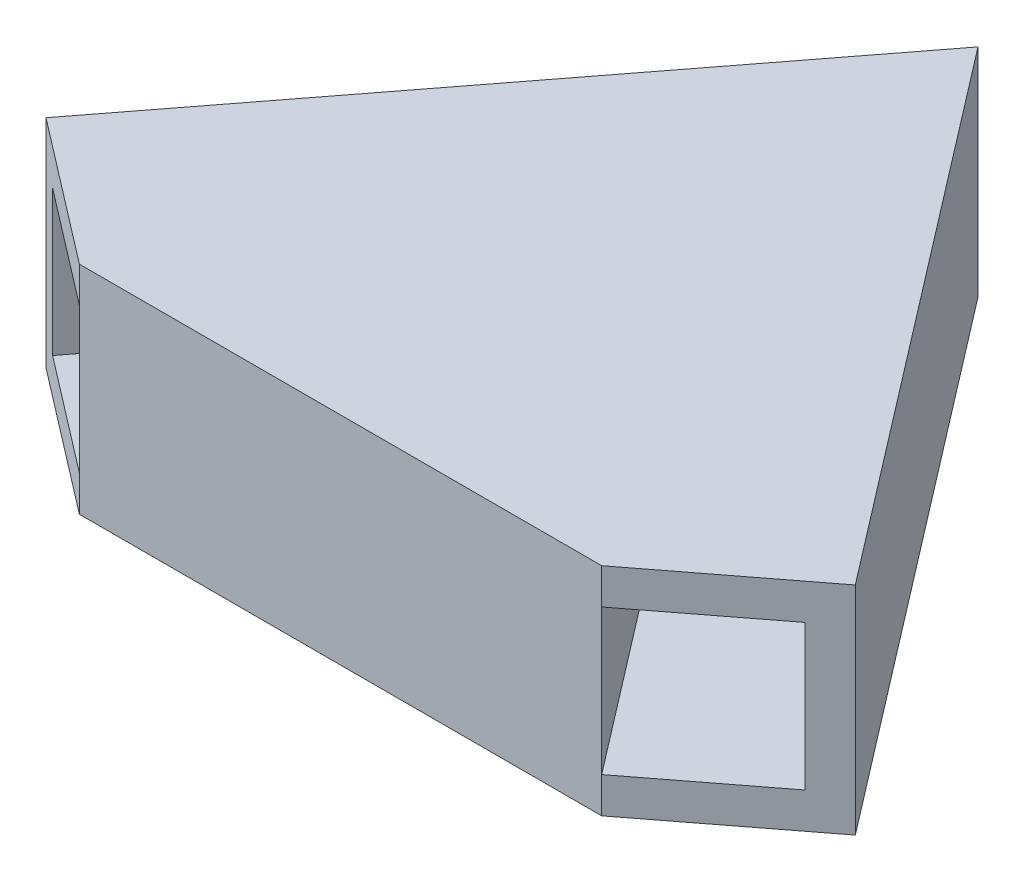
ISO-10303-21;
HEADER;
FILE_DESCRIPTION(('STEP AP214'),'2;1');
FILE_NAME('part.step','',(''),(''),'','','');
FILE_SCHEMA(('AUTOMOTIVE_DESIGN { 1 0 10303 214 1 1 1 1 }'));
ENDSEC;
DATA;
#1=APPLICATION_CONTEXT('core data for automotive mechanical design processes');
#2=APPLICATION_PROTOCOL_DEFINITION('international standard','automotive_design',2000,#1);
#3=PRODUCT_CONTEXT('',#1,'mechanical');
#4=PRODUCT('Part','Part','',(#3));
#5=PRODUCT_RELATED_PRODUCT_CATEGORY('part','',(#4));
#6=PRODUCT_DEFINITION_FORMATION('','',#4);
#7=PRODUCT_DEFINITION_CONTEXT('part definition',#1,'design');
#8=PRODUCT_DEFINITION('design','',#6,#7);
#9=PRODUCT_DEFINITION_SHAPE('','',#8);
#10=(LENGTH_UNIT() NAMED_UNIT(*) SI_UNIT(.MILLI.,.METRE.));
#11=(NAMED_UNIT(*) PLANE_ANGLE_UNIT() SI_UNIT($,.RADIAN.));
#12=(NAMED_UNIT(*) SI_UNIT($,.STERADIAN.) SOLID_ANGLE_UNIT());
#13=UNCERTAINTY_MEASURE_WITH_UNIT(LENGTH_MEASURE(1.E-05),#10,'distance_accuracy_value','');
#14=(GEOMETRIC_REPRESENTATION_CONTEXT(3) GLOBAL_UNCERTAINTY_ASSIGNED_CONTEXT((#13)) GLOBAL_UNIT_ASSIGNED_CONTEXT((#10,
#11,#12)) REPRESENTATION_CONTEXT('',''));
#15=CARTESIAN_POINT('',(0.,0.,0.));
#16=DIRECTION('',(0.,0.,1.));
#17=DIRECTION('',(1.,0.,0.));
#18=AXIS2_PLACEMENT_3D('',#15,#16,#17);
#19=CARTESIAN_POINT('',(0.,5.,0.));
#20=DIRECTION('',(0.,-1.,0.));
#21=DIRECTION('',(0.,0.,-1.));
#22=AXIS2_PLACEMENT_3D('',#19,#20,#21);
#23=PLANE('',#22);
#24=DIRECTION('',(-0.608761429008711,0.,0.793353340291243));
#25=VECTOR('',#24,1.);
#26=CARTESIAN_POINT('',(-36.5256857405226,5.,47.6012004174746));
#27=LINE('',#26,#25);
#28=CARTESIAN_POINT('',(-0.926476193621818,5.,1.20740728286133));
#29=VERTEX_POINT('',#28);
#30=CARTESIAN_POINT('',(-36.5256857405226,5.,47.6012004174746));
#31=VERTEX_POINT('',#30);
#32=EDGE_CURVE('E182',#29,#31,#27,.T.);
#33=ORIENTED_EDGE('',*,*,#32,.F.);
#34=DIRECTION('',(0.793353340291243,0.,0.608761429008711));
#35=VECTOR('',#34,1.);
#36=CARTESIAN_POINT('',(-17.0315490015341,5.,-11.1504497260155));
#37=LINE('',#36,#35);
#38=CARTESIAN_POINT('',(-17.0315490015341,5.,-11.1504497260155));
#39=VERTEX_POINT('',#38);
#40=EDGE_CURVE('E193',#39,#29,#37,.T.);
#41=ORIENTED_EDGE('',*,*,#40,.F.);
#42=DIRECTION('',(0.608761429008711,0.,-0.793353340291243));
#43=VECTOR('',#42,1.);
#44=CARTESIAN_POINT('',(0.,5.,-33.3463965236036));
#45=LINE('',#44,#43);
#46=CARTESIAN_POINT('',(-52.6307585484349,5.,35.2433434085977));
#47=VERTEX_POINT('',#46);
#48=EDGE_CURVE('E212',#47,#39,#45,.T.);
#49=ORIENTED_EDGE('',*,*,#48,.F.);
#50=DIRECTION('',(0.793353340291243,0.,0.60876142900871));
#51=VECTOR('',#50,1.);
#52=CARTESIAN_POINT('',(-36.5256857405226,5.,47.6012004174746));
#53=LINE('',#52,#51);
#54=EDGE_CURVE('E222',#47,#31,#53,.T.);
#55=ORIENTED_EDGE('',*,*,#54,.T.);
#56=EDGE_LOOP('',(#33,#41,#49,#55));
#57=FACE_BOUND('',#56,.T.);
#58=ADVANCED_FACE('F33',(#57),#23,.F.);
#59=CARTESIAN_POINT('',(0.,25.3,0.));
#60=DIRECTION('',(0.,1.,0.));
#61=DIRECTION('',(0.,0.,1.));
#62=AXIS2_PLACEMENT_3D('',#59,#60,#61);
#63=PLANE('',#62);
#64=DIRECTION('',(-0.608761429008711,0.,0.793353340291243));
#65=VECTOR('',#64,1.);
#66=CARTESIAN_POINT('',(-36.5256857405226,25.3,47.6012004174746));
#67=LINE('',#66,#65);
#68=CARTESIAN_POINT('',(-0.926476193621812,25.3,1.20740728286134));
#69=VERTEX_POINT('',#68);
#70=CARTESIAN_POINT('',(-36.5256857405226,25.3,47.6012004174746));
#71=VERTEX_POINT('',#70);
#72=EDGE_CURVE('E185',#69,#71,#67,.T.);
#73=ORIENTED_EDGE('',*,*,#72,.T.);
#74=DIRECTION('',(0.793353340291243,0.,0.60876142900871));
#75=VECTOR('',#74,1.);
#76=CARTESIAN_POINT('',(-56.5975252498911,25.3,32.1995362635542));
#77=LINE('',#76,#75);
#78=CARTESIAN_POINT('',(-52.6307585484349,25.3,35.2433434085977));
#79=VERTEX_POINT('',#78);
#80=EDGE_CURVE('E198',#79,#71,#77,.T.);
#81=ORIENTED_EDGE('',*,*,#80,.F.);
#82=DIRECTION('',(0.608761429008711,0.,-0.793353340291243));
#83=VECTOR('',#82,1.);
#84=CARTESIAN_POINT('',(0.,25.3,-33.3463965236036));
#85=LINE('',#84,#83);
#86=CARTESIAN_POINT('',(-17.0315490015341,25.3,-11.1504497260155));
#87=VERTEX_POINT('',#86);
#88=EDGE_CURVE('E213',#79,#87,#85,.T.);
#89=ORIENTED_EDGE('',*,*,#88,.T.);
#90=DIRECTION('',(0.793353340291243,0.,0.608761429008711));
#91=VECTOR('',#90,1.);
#92=CARTESIAN_POINT('',(-17.0315490015341,25.3,-11.1504497260155));
#93=LINE('',#92,#91);
#94=EDGE_CURVE('E195',#87,#69,#93,.T.);
#95=ORIENTED_EDGE('',*,*,#94,.T.);
#96=EDGE_LOOP('',(#73,#81,#89,#95));
#97=FACE_BOUND('',#96,.T.);
#98=ADVANCED_FACE('F274',(#97),#63,.F.);
#99=CARTESIAN_POINT('',(-17.0315490015341,64.4621464483065,-11.1504497260155));
#100=DIRECTION('',(0.608761429008711,0.,-0.793353340291243));
#101=DIRECTION('',(-0.793353340291243,0.,-0.608761429008711));
#102=AXIS2_PLACEMENT_3D('',#99,#100,#101);
#103=PLANE('',#102);
#104=DIRECTION('',(0.,-1.,0.));
#105=VECTOR('',#104,1.);
#106=CARTESIAN_POINT('',(-0.926476193621818,84.3466744214499,1.20740728286133));
#107=LINE('',#106,#105);
#108=EDGE_CURVE('E186',#69,#29,#107,.T.);
#109=ORIENTED_EDGE('',*,*,#108,.F.);
#110=ORIENTED_EDGE('',*,*,#94,.F.);
#111=DIRECTION('',(0.,-1.,0.));
#112=VECTOR('',#111,1.);
#113=CARTESIAN_POINT('',(-17.0315490015341,64.4621464483065,-11.1504497260155));
#114=LINE('',#113,#112);
#115=EDGE_CURVE('E188',#87,#39,#114,.T.);
#116=ORIENTED_EDGE('',*,*,#115,.T.);
#117=ORIENTED_EDGE('',*,*,#40,.T.);
#118=EDGE_LOOP('',(#109,#110,#116,#117));
#119=FACE_BOUND('',#118,.T.);
#120=ADVANCED_FACE('F276',(#119),#103,.F.);
#121=CARTESIAN_POINT('',(0.,25.3,-33.3463965236036));
#122=DIRECTION('',(-0.793353340291243,0.,-0.608761429008711));
#123=DIRECTION('',(-0.608761429008711,0.,0.793353340291243));
#124=AXIS2_PLACEMENT_3D('',#121,#122,#123);
#125=PLANE('',#124);
#126=ORIENTED_EDGE('',*,*,#115,.F.);
#127=ORIENTED_EDGE('',*,*,#88,.F.);
#128=DIRECTION('',(0.,-1.,0.));
#129=VECTOR('',#128,1.);
#130=CARTESIAN_POINT('',(-52.6307585484349,25.3,35.2433434085977));
#131=LINE('',#130,#129);
#132=EDGE_CURVE('E216',#79,#47,#131,.T.);
#133=ORIENTED_EDGE('',*,*,#132,.T.);
#134=ORIENTED_EDGE('',*,*,#48,.T.);
#135=EDGE_LOOP('',(#126,#127,#133,#134));
#136=FACE_BOUND('',#135,.T.);
#137=ADVANCED_FACE('F271',(#136),#125,.F.);
#138=CARTESIAN_POINT('',(-36.5256857405226,5.,47.6012004174746));
#139=DIRECTION('',(0.60876142900871,0.,-0.793353340291243));
#140=DIRECTION('',(-0.793353340291243,0.,-0.608761429008711));
#141=AXIS2_PLACEMENT_3D('',#138,#139,#140);
#142=PLANE('',#141);
#143=DIRECTION('',(0.793353340291243,0.,0.60876142900871));
#144=VECTOR('',#143,1.);
#145=CARTESIAN_POINT('',(-36.5256857405226,0.,47.6012004174746));
#146=LINE('',#145,#144);
#147=CARTESIAN_POINT('',(-56.5975252498911,0.,32.1995362635542));
#148=VERTEX_POINT('',#147);
#149=CARTESIAN_POINT('',(-36.5256857405226,0.,47.6012004174746));
#150=VERTEX_POINT('',#149);
#151=EDGE_CURVE('E221',#148,#150,#146,.T.);
#152=ORIENTED_EDGE('',*,*,#151,.T.);
#153=DIRECTION('',(0.,-1.,0.));
#154=VECTOR('',#153,1.);
#155=CARTESIAN_POINT('',(-36.5256857405226,5.,47.6012004174746));
#156=LINE('',#155,#154);
#157=EDGE_CURVE('E11',#31,#150,#156,.T.);
#158=ORIENTED_EDGE('',*,*,#157,.F.);
#159=ORIENTED_EDGE('',*,*,#54,.F.);
#160=ORIENTED_EDGE('',*,*,#132,.F.);
#161=ORIENTED_EDGE('',*,*,#80,.T.);
#162=DIRECTION('',(0.,-1.,0.));
#163=VECTOR('',#162,1.);
#164=CARTESIAN_POINT('',(-36.5256857405226,30.3,47.6012004174746));
#165=LINE('',#164,#163);
#166=CARTESIAN_POINT('',(-36.5256857405226,30.3,47.6012004174746));
#167=VERTEX_POINT('',#166);
#168=EDGE_CURVE('E207',#167,#71,#165,.T.);
#169=ORIENTED_EDGE('',*,*,#168,.F.);
#170=DIRECTION('',(0.793353340291243,0.,0.60876142900871));
#171=VECTOR('',#170,1.);
#172=CARTESIAN_POINT('',(-56.5975252498911,30.3,32.1995362635542));
#173=LINE('',#172,#171);
#174=CARTESIAN_POINT('',(-56.5975252498911,30.3,32.1995362635542));
#175=VERTEX_POINT('',#174);
#176=EDGE_CURVE('E203',#175,#167,#173,.T.);
#177=ORIENTED_EDGE('',*,*,#176,.F.);
#178=DIRECTION('',(0.,-1.,0.));
#179=VECTOR('',#178,1.);
#180=CARTESIAN_POINT('',(-56.5975252498911,5.,32.1995362635542));
#181=LINE('',#180,#179);
#182=EDGE_CURVE('E224',#175,#148,#181,.T.);
#183=ORIENTED_EDGE('',*,*,#182,.T.);
#184=EDGE_LOOP('',(#152,#158,#159,#160,#161,#169,#177,#183));
#185=FACE_BOUND('',#184,.T.);
#186=ADVANCED_FACE('F35',(#185),#142,.F.);
#187=CARTESIAN_POINT('',(0.,5.,47.6012004174746));
#188=DIRECTION('',(0.,0.,-1.));
#189=DIRECTION('',(-1.,0.,0.));
#190=AXIS2_PLACEMENT_3D('',#187,#188,#189);
#191=PLANE('',#190);
#192=DIRECTION('',(1.,0.,0.));
#193=VECTOR('',#192,1.);
#194=CARTESIAN_POINT('',(0.,0.,47.6012004174746));
#195=LINE('',#194,#193);
#196=CARTESIAN_POINT('',(36.5256857405226,0.,47.6012004174746));
#197=VERTEX_POINT('',#196);
#198=EDGE_CURVE('E228',#150,#197,#195,.T.);
#199=ORIENTED_EDGE('',*,*,#198,.T.);
#200=DIRECTION('',(0.,-1.,0.));
#201=VECTOR('',#200,1.);
#202=CARTESIAN_POINT('',(36.5256857405226,5.,47.6012004174746));
#203=LINE('',#202,#201);
#204=CARTESIAN_POINT('',(36.5256857405226,5.,47.6012004174746));
#205=VERTEX_POINT('',#204);
#206=EDGE_CURVE('E171',#205,#197,#203,.T.);
#207=ORIENTED_EDGE('',*,*,#206,.F.);
#208=DIRECTION('',(0.,-1.,0.));
#209=VECTOR('',#208,1.);
#210=CARTESIAN_POINT('',(36.5256857405226,84.3466744214499,47.6012004174746));
#211=LINE('',#210,#209);
#212=CARTESIAN_POINT('',(36.5256857405226,25.3,47.6012004174746));
#213=VERTEX_POINT('',#212);
#214=EDGE_CURVE('E139',#213,#205,#211,.T.);
#215=ORIENTED_EDGE('',*,*,#214,.F.);
#216=DIRECTION('',(0.,-1.,0.));
#217=VECTOR('',#216,1.);
#218=CARTESIAN_POINT('',(36.5256857405226,30.3,47.6012004174746));
#219=LINE('',#218,#217);
#220=CARTESIAN_POINT('',(36.5256857405226,30.3,47.6012004174746));
#221=VERTEX_POINT('',#220);
#222=EDGE_CURVE('E156',#221,#213,#219,.T.);
#223=ORIENTED_EDGE('',*,*,#222,.F.);
#224=DIRECTION('',(1.,0.,0.));
#225=VECTOR('',#224,1.);
#226=CARTESIAN_POINT('',(-36.5256857405226,30.3,47.6012004174746));
#227=LINE('',#226,#225);
#228=EDGE_CURVE('E205',#167,#221,#227,.T.);
#229=ORIENTED_EDGE('',*,*,#228,.F.);
#230=ORIENTED_EDGE('',*,*,#168,.T.);
#231=DIRECTION('',(0.,-1.,0.));
#232=VECTOR('',#231,1.);
#233=CARTESIAN_POINT('',(-36.5256857405226,84.3466744214499,47.6012004174746));
#234=LINE('',#233,#232);
#235=EDGE_CURVE('E181',#71,#31,#234,.T.);
#236=ORIENTED_EDGE('',*,*,#235,.T.);
#237=ORIENTED_EDGE('',*,*,#157,.T.);
#238=EDGE_LOOP('',(#199,#207,#215,#223,#229,#230,#236,#237));
#239=FACE_BOUND('',#238,.T.);
#240=ADVANCED_FACE('F260',(#239),#191,.F.);
#241=CARTESIAN_POINT('',(-56.5975252498911,5.,32.1995362635542));
#242=DIRECTION('',(0.793353340291243,0.,0.608761429008711));
#243=DIRECTION('',(0.608761429008711,0.,-0.793353340291243));
#244=AXIS2_PLACEMENT_3D('',#241,#242,#243);
#245=PLANE('',#244);
#246=DIRECTION('',(-0.608761429008711,0.,0.793353340291243));
#247=VECTOR('',#246,1.);
#248=CARTESIAN_POINT('',(-56.5975252498911,0.,32.1995362635542));
#249=LINE('',#248,#247);
#250=CARTESIAN_POINT('',(0.,0.,-41.5597946821266));
#251=VERTEX_POINT('',#250);
#252=EDGE_CURVE('E225',#251,#148,#249,.T.);
#253=ORIENTED_EDGE('',*,*,#252,.T.);
#254=ORIENTED_EDGE('',*,*,#182,.F.);
#255=DIRECTION('',(-0.608761429008711,0.,0.793353340291243));
#256=VECTOR('',#255,1.);
#257=CARTESIAN_POINT('',(0.,30.3,-41.5597946821266));
#258=LINE('',#257,#256);
#259=CARTESIAN_POINT('',(0.,30.3,-41.5597946821266));
#260=VERTEX_POINT('',#259);
#261=EDGE_CURVE('E200',#260,#175,#258,.T.);
#262=ORIENTED_EDGE('',*,*,#261,.F.);
#263=DIRECTION('',(0.,-1.,0.));
#264=VECTOR('',#263,1.);
#265=CARTESIAN_POINT('',(0.,5.,-41.5597946821266));
#266=LINE('',#265,#264);
#267=EDGE_CURVE('E41',#260,#251,#266,.T.);
#268=ORIENTED_EDGE('',*,*,#267,.T.);
#269=EDGE_LOOP('',(#253,#254,#262,#268));
#270=FACE_BOUND('',#269,.T.);
#271=ADVANCED_FACE('F235',(#270),#245,.F.);
#272=CARTESIAN_POINT('',(0.,0.,0.));
#273=DIRECTION('',(0.,-1.,0.));
#274=DIRECTION('',(0.,0.,-1.));
#275=AXIS2_PLACEMENT_3D('',#272,#273,#274);
#276=PLANE('',#275);
#277=ORIENTED_EDGE('',*,*,#151,.F.);
#278=ORIENTED_EDGE('',*,*,#252,.F.);
#279=DIRECTION('',(0.608761429008711,0.,0.793353340291243));
#280=VECTOR('',#279,1.);
#281=CARTESIAN_POINT('',(56.5975252498911,0.,32.1995362635542));
#282=LINE('',#281,#280);
#283=CARTESIAN_POINT('',(56.5975252498911,0.,32.1995362635542));
#284=VERTEX_POINT('',#283);
#285=EDGE_CURVE('E172',#251,#284,#282,.T.);
#286=ORIENTED_EDGE('',*,*,#285,.T.);
#287=DIRECTION('',(-0.793353340291243,0.,0.608761429008711));
#288=VECTOR('',#287,1.);
#289=CARTESIAN_POINT('',(36.5256857405226,0.,47.6012004174746));
#290=LINE('',#289,#288);
#291=EDGE_CURVE('E167',#284,#197,#290,.T.);
#292=ORIENTED_EDGE('',*,*,#291,.T.);
#293=ORIENTED_EDGE('',*,*,#198,.F.);
#294=EDGE_LOOP('',(#277,#278,#286,#292,#293));
#295=FACE_BOUND('',#294,.T.);
#296=ADVANCED_FACE('F243',(#295),#276,.T.);
#297=CARTESIAN_POINT('',(0.,30.3,0.));
#298=DIRECTION('',(0.,1.,0.));
#299=DIRECTION('',(0.,0.,1.));
#300=AXIS2_PLACEMENT_3D('',#297,#298,#299);
#301=PLANE('',#300);
#302=ORIENTED_EDGE('',*,*,#261,.T.);
#303=ORIENTED_EDGE('',*,*,#176,.T.);
#304=ORIENTED_EDGE('',*,*,#228,.T.);
#305=DIRECTION('',(-0.793353340291243,0.,0.608761429008711));
#306=VECTOR('',#305,1.);
#307=CARTESIAN_POINT('',(56.5975252498911,30.3,32.1995362635542));
#308=LINE('',#307,#306);
#309=CARTESIAN_POINT('',(56.5975252498911,30.3,32.1995362635542));
#310=VERTEX_POINT('',#309);
#311=EDGE_CURVE('E153',#310,#221,#308,.T.);
#312=ORIENTED_EDGE('',*,*,#311,.F.);
#313=DIRECTION('',(0.608761429008711,0.,0.793353340291243));
#314=VECTOR('',#313,1.);
#315=CARTESIAN_POINT('',(0.,30.3,-41.5597946821266));
#316=LINE('',#315,#314);
#317=EDGE_CURVE('E150',#260,#310,#316,.T.);
#318=ORIENTED_EDGE('',*,*,#317,.F.);
#319=EDGE_LOOP('',(#302,#303,#304,#312,#318));
#320=FACE_BOUND('',#319,.T.);
#321=ADVANCED_FACE('F251',(#320),#301,.T.);
#322=CARTESIAN_POINT('',(-36.5256857405226,84.3466744214499,47.6012004174746));
#323=DIRECTION('',(0.793353340291243,0.,0.608761429008711));
#324=DIRECTION('',(0.608761429008711,0.,-0.793353340291243));
#325=AXIS2_PLACEMENT_3D('',#322,#323,#324);
#326=PLANE('',#325);
#327=ORIENTED_EDGE('',*,*,#72,.F.);
#328=ORIENTED_EDGE('',*,*,#108,.T.);
#329=ORIENTED_EDGE('',*,*,#32,.T.);
#330=ORIENTED_EDGE('',*,*,#235,.F.);
#331=EDGE_LOOP('',(#327,#328,#329,#330));
#332=FACE_BOUND('',#331,.T.);
#333=ADVANCED_FACE('F265',(#332),#326,.F.);
#334=CARTESIAN_POINT('',(36.5256857405226,5.,47.6012004174746));
#335=DIRECTION('',(0.608761429008711,0.,0.793353340291243));
#336=DIRECTION('',(0.793353340291243,0.,-0.608761429008711));
#337=AXIS2_PLACEMENT_3D('',#334,#335,#336);
#338=PLANE('',#337);
#339=ORIENTED_EDGE('',*,*,#291,.F.);
#340=DIRECTION('',(0.,-1.,0.));
#341=VECTOR('',#340,1.);
#342=CARTESIAN_POINT('',(56.5975252498911,5.,32.1995362635542));
#343=LINE('',#342,#341);
#344=EDGE_CURVE('E179',#310,#284,#343,.T.);
#345=ORIENTED_EDGE('',*,*,#344,.F.);
#346=ORIENTED_EDGE('',*,*,#311,.T.);
#347=ORIENTED_EDGE('',*,*,#222,.T.);
#348=DIRECTION('',(-0.793353340291243,0.,0.608761429008711));
#349=VECTOR('',#348,1.);
#350=CARTESIAN_POINT('',(56.5975252498911,25.3,32.1995362635542));
#351=LINE('',#350,#349);
#352=CARTESIAN_POINT('',(52.6307585484349,25.3,35.2433434085977));
#353=VERTEX_POINT('',#352);
#354=EDGE_CURVE('E135',#353,#213,#351,.T.);
#355=ORIENTED_EDGE('',*,*,#354,.F.);
#356=DIRECTION('',(0.,-1.,0.));
#357=VECTOR('',#356,1.);
#358=CARTESIAN_POINT('',(52.6307585484349,25.3,35.2433434085977));
#359=LINE('',#358,#357);
#360=CARTESIAN_POINT('',(52.6307585484349,5.,35.2433434085977));
#361=VERTEX_POINT('',#360);
#362=EDGE_CURVE('E162',#353,#361,#359,.T.);
#363=ORIENTED_EDGE('',*,*,#362,.T.);
#364=DIRECTION('',(-0.793353340291243,0.,0.608761429008711));
#365=VECTOR('',#364,1.);
#366=CARTESIAN_POINT('',(36.5256857405226,5.,47.6012004174746));
#367=LINE('',#366,#365);
#368=EDGE_CURVE('E168',#361,#205,#367,.T.);
#369=ORIENTED_EDGE('',*,*,#368,.T.);
#370=ORIENTED_EDGE('',*,*,#206,.T.);
#371=EDGE_LOOP('',(#339,#345,#346,#347,#355,#363,#369,#370));
#372=FACE_BOUND('',#371,.T.);
#373=ADVANCED_FACE('F255',(#372),#338,.T.);
#374=CARTESIAN_POINT('',(56.5975252498911,5.,32.1995362635542));
#375=DIRECTION('',(0.793353340291243,0.,-0.608761429008711));
#376=DIRECTION('',(-0.608761429008711,0.,-0.793353340291243));
#377=AXIS2_PLACEMENT_3D('',#374,#375,#376);
#378=PLANE('',#377);
#379=ORIENTED_EDGE('',*,*,#285,.F.);
#380=ORIENTED_EDGE('',*,*,#267,.F.);
#381=ORIENTED_EDGE('',*,*,#317,.T.);
#382=ORIENTED_EDGE('',*,*,#344,.T.);
#383=EDGE_LOOP('',(#379,#380,#381,#382));
#384=FACE_BOUND('',#383,.T.);
#385=ADVANCED_FACE('F239',(#384),#378,.T.);
#386=CARTESIAN_POINT('',(0.,5.,0.));
#387=DIRECTION('',(0.,-1.,0.));
#388=DIRECTION('',(0.,0.,-1.));
#389=AXIS2_PLACEMENT_3D('',#386,#387,#388);
#390=PLANE('',#389);
#391=DIRECTION('',(-0.793353340291243,0.,0.608761429008711));
#392=VECTOR('',#391,1.);
#393=CARTESIAN_POINT('',(17.0315490015341,5.,-11.1504497260155));
#394=LINE('',#393,#392);
#395=CARTESIAN_POINT('',(17.0315490015341,5.,-11.1504497260155));
#396=VERTEX_POINT('',#395);
#397=CARTESIAN_POINT('',(0.926476193621816,5.,1.20740728286134));
#398=VERTEX_POINT('',#397);
#399=EDGE_CURVE('E130',#396,#398,#394,.T.);
#400=ORIENTED_EDGE('',*,*,#399,.T.);
#401=DIRECTION('',(0.608761429008711,0.,0.793353340291242));
#402=VECTOR('',#401,1.);
#403=CARTESIAN_POINT('',(36.5256857405226,5.,47.6012004174746));
#404=LINE('',#403,#402);
#405=EDGE_CURVE('E143',#398,#205,#404,.T.);
#406=ORIENTED_EDGE('',*,*,#405,.T.);
#407=ORIENTED_EDGE('',*,*,#368,.F.);
#408=DIRECTION('',(-0.608761429008711,0.,-0.793353340291243));
#409=VECTOR('',#408,1.);
#410=CARTESIAN_POINT('',(0.,5.,-33.3463965236036));
#411=LINE('',#410,#409);
#412=EDGE_CURVE('E159',#361,#396,#411,.T.);
#413=ORIENTED_EDGE('',*,*,#412,.T.);
#414=EDGE_LOOP('',(#400,#406,#407,#413));
#415=FACE_BOUND('',#414,.T.);
#416=ADVANCED_FACE('F362',(#415),#390,.F.);
#417=CARTESIAN_POINT('',(0.,25.3,-33.3463965236036));
#418=DIRECTION('',(-0.793353340291243,0.,0.608761429008711));
#419=DIRECTION('',(0.608761429008711,0.,0.793353340291243));
#420=AXIS2_PLACEMENT_3D('',#417,#418,#419);
#421=PLANE('',#420);
#422=DIRECTION('',(0.,-1.,0.));
#423=VECTOR('',#422,1.);
#424=CARTESIAN_POINT('',(17.0315490015341,64.4621464483065,-11.1504497260155));
#425=LINE('',#424,#423);
#426=CARTESIAN_POINT('',(17.0315490015341,25.3,-11.1504497260155));
#427=VERTEX_POINT('',#426);
#428=EDGE_CURVE('E53',#427,#396,#425,.T.);
#429=ORIENTED_EDGE('',*,*,#428,.T.);
#430=ORIENTED_EDGE('',*,*,#412,.F.);
#431=ORIENTED_EDGE('',*,*,#362,.F.);
#432=DIRECTION('',(-0.608761429008711,0.,-0.793353340291243));
#433=VECTOR('',#432,1.);
#434=CARTESIAN_POINT('',(0.,25.3,-33.3463965236036));
#435=LINE('',#434,#433);
#436=EDGE_CURVE('E160',#353,#427,#435,.T.);
#437=ORIENTED_EDGE('',*,*,#436,.T.);
#438=EDGE_LOOP('',(#429,#430,#431,#437));
#439=FACE_BOUND('',#438,.T.);
#440=ADVANCED_FACE('F353',(#439),#421,.T.);
#441=CARTESIAN_POINT('',(0.,25.3,0.));
#442=DIRECTION('',(0.,1.,0.));
#443=DIRECTION('',(0.,0.,1.));
#444=AXIS2_PLACEMENT_3D('',#441,#442,#443);
#445=PLANE('',#444);
#446=ORIENTED_EDGE('',*,*,#354,.T.);
#447=DIRECTION('',(0.608761429008711,0.,0.793353340291243));
#448=VECTOR('',#447,1.);
#449=CARTESIAN_POINT('',(36.5256857405226,25.3,47.6012004174746));
#450=LINE('',#449,#448);
#451=CARTESIAN_POINT('',(0.926476193621818,25.3,1.20740728286133));
#452=VERTEX_POINT('',#451);
#453=EDGE_CURVE('E133',#452,#213,#450,.T.);
#454=ORIENTED_EDGE('',*,*,#453,.F.);
#455=DIRECTION('',(-0.793353340291243,0.,0.608761429008711));
#456=VECTOR('',#455,1.);
#457=CARTESIAN_POINT('',(17.0315490015341,25.3,-11.1504497260155));
#458=LINE('',#457,#456);
#459=EDGE_CURVE('E124',#427,#452,#458,.T.);
#460=ORIENTED_EDGE('',*,*,#459,.F.);
#461=ORIENTED_EDGE('',*,*,#436,.F.);
#462=EDGE_LOOP('',(#446,#454,#460,#461));
#463=FACE_BOUND('',#462,.T.);
#464=ADVANCED_FACE('F134',(#463),#445,.F.);
#465=CARTESIAN_POINT('',(17.0315490015341,64.4621464483065,-11.1504497260155));
#466=DIRECTION('',(0.608761429008711,0.,0.793353340291243));
#467=DIRECTION('',(0.793353340291243,0.,-0.608761429008711));
#468=AXIS2_PLACEMENT_3D('',#465,#466,#467);
#469=PLANE('',#468);
#470=DIRECTION('',(0.,-1.,0.));
#471=VECTOR('',#470,1.);
#472=CARTESIAN_POINT('',(0.926476193621818,84.3466744214499,1.20740728286133));
#473=LINE('',#472,#471);
#474=EDGE_CURVE('E48',#452,#398,#473,.T.);
#475=ORIENTED_EDGE('',*,*,#474,.T.);
#476=ORIENTED_EDGE('',*,*,#399,.F.);
#477=ORIENTED_EDGE('',*,*,#428,.F.);
#478=ORIENTED_EDGE('',*,*,#459,.T.);
#479=EDGE_LOOP('',(#475,#476,#477,#478));
#480=FACE_BOUND('',#479,.T.);
#481=ADVANCED_FACE('F126',(#480),#469,.T.);
#482=CARTESIAN_POINT('',(36.5256857405226,84.3466744214499,47.6012004174746));
#483=DIRECTION('',(0.793353340291243,0.,-0.608761429008711));
#484=DIRECTION('',(-0.608761429008711,0.,-0.793353340291243));
#485=AXIS2_PLACEMENT_3D('',#482,#483,#484);
#486=PLANE('',#485);
#487=ORIENTED_EDGE('',*,*,#474,.F.);
#488=ORIENTED_EDGE('',*,*,#453,.T.);
#489=ORIENTED_EDGE('',*,*,#214,.T.);
#490=ORIENTED_EDGE('',*,*,#405,.F.);
#491=EDGE_LOOP('',(#487,#488,#489,#490));
#492=FACE_BOUND('',#491,.T.);
#493=ADVANCED_FACE('F142',(#492),#486,.T.);
#494=CLOSED_SHELL('',(#58,#98,#120,#137,#186,#240,#271,#296,#321,#333,#373,#385,#416,#440,#464,
#481,#493));
#495=MANIFOLD_SOLID_BREP('B2',#494);
#496=ADVANCED_BREP_SHAPE_REPRESENTATION('',(#18,#495),#14);
#497=SHAPE_DEFINITION_REPRESENTATION(#9,#496);
ENDSEC;
END-ISO-10303-21;
